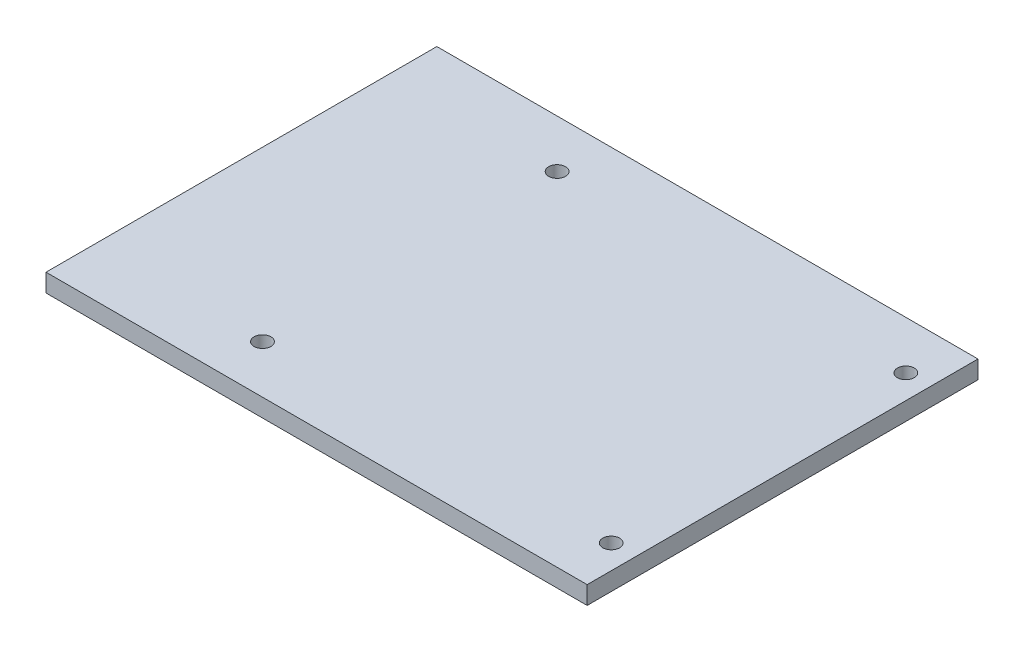
ISO-10303-21;
HEADER;
FILE_DESCRIPTION(('STEP AP214'),'2;1');
FILE_NAME('part.step','',(''),(''),'','','');
FILE_SCHEMA(('AUTOMOTIVE_DESIGN { 1 0 10303 214 1 1 1 1 }'));
ENDSEC;
DATA;
#1=APPLICATION_CONTEXT('core data for automotive mechanical design processes');
#2=APPLICATION_PROTOCOL_DEFINITION('international standard','automotive_design',2000,#1);
#3=PRODUCT_CONTEXT('',#1,'mechanical');
#4=PRODUCT('Part','Part','',(#3));
#5=PRODUCT_RELATED_PRODUCT_CATEGORY('part','',(#4));
#6=PRODUCT_DEFINITION_FORMATION('','',#4);
#7=PRODUCT_DEFINITION_CONTEXT('part definition',#1,'design');
#8=PRODUCT_DEFINITION('design','',#6,#7);
#9=PRODUCT_DEFINITION_SHAPE('','',#8);
#10=(LENGTH_UNIT() NAMED_UNIT(*) SI_UNIT(.MILLI.,.METRE.));
#11=(NAMED_UNIT(*) PLANE_ANGLE_UNIT() SI_UNIT($,.RADIAN.));
#12=(NAMED_UNIT(*) SI_UNIT($,.STERADIAN.) SOLID_ANGLE_UNIT());
#13=UNCERTAINTY_MEASURE_WITH_UNIT(LENGTH_MEASURE(1.E-05),#10,'distance_accuracy_value','');
#14=(GEOMETRIC_REPRESENTATION_CONTEXT(3) GLOBAL_UNCERTAINTY_ASSIGNED_CONTEXT((#13)) GLOBAL_UNIT_ASSIGNED_CONTEXT((#10,
#11,#12)) REPRESENTATION_CONTEXT('',''));
#15=CARTESIAN_POINT('',(0.,0.,0.));
#16=DIRECTION('',(0.,0.,1.));
#17=DIRECTION('',(1.,0.,0.));
#18=AXIS2_PLACEMENT_3D('',#15,#16,#17);
#19=CARTESIAN_POINT('',(45.,3.,32.5));
#20=DIRECTION('',(-1.,0.,0.));
#21=DIRECTION('',(0.,0.,1.));
#22=AXIS2_PLACEMENT_3D('',#19,#20,#21);
#23=PLANE('',#22);
#24=DIRECTION('',(0.,0.,-1.));
#25=VECTOR('',#24,1.);
#26=CARTESIAN_POINT('',(45.,0.,32.5));
#27=LINE('',#26,#25);
#28=CARTESIAN_POINT('',(45.,0.,32.5));
#29=VERTEX_POINT('',#28);
#30=CARTESIAN_POINT('',(45.,0.,-32.5));
#31=VERTEX_POINT('',#30);
#32=EDGE_CURVE('E104',#29,#31,#27,.T.);
#33=ORIENTED_EDGE('',*,*,#32,.T.);
#34=DIRECTION('',(0.,-1.,0.));
#35=VECTOR('',#34,1.);
#36=CARTESIAN_POINT('',(45.,3.,-32.5));
#37=LINE('',#36,#35);
#38=CARTESIAN_POINT('',(45.,3.,-32.5));
#39=VERTEX_POINT('',#38);
#40=EDGE_CURVE('E11',#39,#31,#37,.T.);
#41=ORIENTED_EDGE('',*,*,#40,.F.);
#42=DIRECTION('',(0.,0.,-1.));
#43=VECTOR('',#42,1.);
#44=CARTESIAN_POINT('',(45.,3.,32.5));
#45=LINE('',#44,#43);
#46=CARTESIAN_POINT('',(45.,3.,32.5));
#47=VERTEX_POINT('',#46);
#48=EDGE_CURVE('E92',#47,#39,#45,.T.);
#49=ORIENTED_EDGE('',*,*,#48,.F.);
#50=DIRECTION('',(0.,-1.,0.));
#51=VECTOR('',#50,1.);
#52=CARTESIAN_POINT('',(45.,3.,32.5));
#53=LINE('',#52,#51);
#54=EDGE_CURVE('E100',#47,#29,#53,.T.);
#55=ORIENTED_EDGE('',*,*,#54,.T.);
#56=EDGE_LOOP('',(#33,#41,#49,#55));
#57=FACE_BOUND('',#56,.T.);
#58=ADVANCED_FACE('F41',(#57),#23,.F.);
#59=CARTESIAN_POINT('',(-45.,3.,-32.5));
#60=DIRECTION('',(0.,0.,1.));
#61=DIRECTION('',(1.,0.,0.));
#62=AXIS2_PLACEMENT_3D('',#59,#60,#61);
#63=PLANE('',#62);
#64=DIRECTION('',(-1.,0.,0.));
#65=VECTOR('',#64,1.);
#66=CARTESIAN_POINT('',(-45.,0.,-32.5));
#67=LINE('',#66,#65);
#68=CARTESIAN_POINT('',(-45.,0.,-32.5));
#69=VERTEX_POINT('',#68);
#70=EDGE_CURVE('E96',#31,#69,#67,.T.);
#71=ORIENTED_EDGE('',*,*,#70,.T.);
#72=DIRECTION('',(0.,-1.,0.));
#73=VECTOR('',#72,1.);
#74=CARTESIAN_POINT('',(-45.,3.,-32.5));
#75=LINE('',#74,#73);
#76=CARTESIAN_POINT('',(-45.,3.,-32.5));
#77=VERTEX_POINT('',#76);
#78=EDGE_CURVE('E49',#77,#69,#75,.T.);
#79=ORIENTED_EDGE('',*,*,#78,.F.);
#80=DIRECTION('',(-1.,0.,0.));
#81=VECTOR('',#80,1.);
#82=CARTESIAN_POINT('',(-45.,3.,-32.5));
#83=LINE('',#82,#81);
#84=EDGE_CURVE('E87',#39,#77,#83,.T.);
#85=ORIENTED_EDGE('',*,*,#84,.F.);
#86=ORIENTED_EDGE('',*,*,#40,.T.);
#87=EDGE_LOOP('',(#71,#79,#85,#86));
#88=FACE_BOUND('',#87,.T.);
#89=ADVANCED_FACE('F95',(#88),#63,.F.);
#90=CARTESIAN_POINT('',(-45.,3.,32.5));
#91=DIRECTION('',(1.,0.,0.));
#92=DIRECTION('',(0.,0.,-1.));
#93=AXIS2_PLACEMENT_3D('',#90,#91,#92);
#94=PLANE('',#93);
#95=DIRECTION('',(0.,0.,1.));
#96=VECTOR('',#95,1.);
#97=CARTESIAN_POINT('',(-45.,0.,32.5));
#98=LINE('',#97,#96);
#99=CARTESIAN_POINT('',(-45.,0.,32.5));
#100=VERTEX_POINT('',#99);
#101=EDGE_CURVE('E74',#69,#100,#98,.T.);
#102=ORIENTED_EDGE('',*,*,#101,.T.);
#103=DIRECTION('',(0.,-1.,0.));
#104=VECTOR('',#103,1.);
#105=CARTESIAN_POINT('',(-45.,3.,32.5));
#106=LINE('',#105,#104);
#107=CARTESIAN_POINT('',(-45.,3.,32.5));
#108=VERTEX_POINT('',#107);
#109=EDGE_CURVE('E97',#108,#100,#106,.T.);
#110=ORIENTED_EDGE('',*,*,#109,.F.);
#111=DIRECTION('',(0.,0.,1.));
#112=VECTOR('',#111,1.);
#113=CARTESIAN_POINT('',(-45.,3.,32.5));
#114=LINE('',#113,#112);
#115=EDGE_CURVE('E90',#77,#108,#114,.T.);
#116=ORIENTED_EDGE('',*,*,#115,.F.);
#117=ORIENTED_EDGE('',*,*,#78,.T.);
#118=EDGE_LOOP('',(#102,#110,#116,#117));
#119=FACE_BOUND('',#118,.T.);
#120=ADVANCED_FACE('F98',(#119),#94,.F.);
#121=CARTESIAN_POINT('',(-45.,3.,32.5));
#122=DIRECTION('',(0.,0.,-1.));
#123=DIRECTION('',(-1.,0.,0.));
#124=AXIS2_PLACEMENT_3D('',#121,#122,#123);
#125=PLANE('',#124);
#126=DIRECTION('',(1.,0.,0.));
#127=VECTOR('',#126,1.);
#128=CARTESIAN_POINT('',(-45.,0.,32.5));
#129=LINE('',#128,#127);
#130=EDGE_CURVE('E80',#100,#29,#129,.T.);
#131=ORIENTED_EDGE('',*,*,#130,.T.);
#132=ORIENTED_EDGE('',*,*,#54,.F.);
#133=DIRECTION('',(1.,0.,0.));
#134=VECTOR('',#133,1.);
#135=CARTESIAN_POINT('',(-45.,3.,32.5));
#136=LINE('',#135,#134);
#137=EDGE_CURVE('E57',#108,#47,#136,.T.);
#138=ORIENTED_EDGE('',*,*,#137,.F.);
#139=ORIENTED_EDGE('',*,*,#109,.T.);
#140=EDGE_LOOP('',(#131,#132,#138,#139));
#141=FACE_BOUND('',#140,.T.);
#142=ADVANCED_FACE('F112',(#141),#125,.F.);
#143=CARTESIAN_POINT('',(0.,3.,0.));
#144=DIRECTION('',(0.,-1.,0.));
#145=DIRECTION('',(0.,0.,-1.));
#146=AXIS2_PLACEMENT_3D('',#143,#144,#145);
#147=PLANE('',#146);
#148=CARTESIAN_POINT('',(41.,3.,-24.5));
#149=DIRECTION('',(0.,1.,0.));
#150=DIRECTION('',(0.,0.,1.));
#151=AXIS2_PLACEMENT_3D('',#148,#149,#150);
#152=CIRCLE('',#151,1.4);
#153=CARTESIAN_POINT('',(41.,3.,-23.1));
#154=VERTEX_POINT('',#153);
#155=EDGE_CURVE('E121',#154,#154,#152,.T.);
#156=ORIENTED_EDGE('',*,*,#155,.F.);
#157=EDGE_LOOP('',(#156));
#158=FACE_BOUND('',#157,.T.);
#159=CARTESIAN_POINT('',(-17.,3.,24.5));
#160=DIRECTION('',(0.,1.,0.));
#161=DIRECTION('',(0.,0.,1.));
#162=AXIS2_PLACEMENT_3D('',#159,#160,#161);
#163=CIRCLE('',#162,1.4);
#164=CARTESIAN_POINT('',(-17.,3.,25.9));
#165=VERTEX_POINT('',#164);
#166=EDGE_CURVE('E127',#165,#165,#163,.T.);
#167=ORIENTED_EDGE('',*,*,#166,.F.);
#168=EDGE_LOOP('',(#167));
#169=FACE_BOUND('',#168,.T.);
#170=CARTESIAN_POINT('',(41.,3.,24.5));
#171=DIRECTION('',(0.,1.,0.));
#172=DIRECTION('',(0.,0.,1.));
#173=AXIS2_PLACEMENT_3D('',#170,#171,#172);
#174=CIRCLE('',#173,1.4);
#175=CARTESIAN_POINT('',(41.,3.,25.9));
#176=VERTEX_POINT('',#175);
#177=EDGE_CURVE('E128',#176,#176,#174,.T.);
#178=ORIENTED_EDGE('',*,*,#177,.F.);
#179=EDGE_LOOP('',(#178));
#180=FACE_BOUND('',#179,.T.);
#181=CARTESIAN_POINT('',(-17.,3.,-24.5));
#182=DIRECTION('',(0.,1.,0.));
#183=DIRECTION('',(0.,0.,1.));
#184=AXIS2_PLACEMENT_3D('',#181,#182,#183);
#185=CIRCLE('',#184,1.4);
#186=CARTESIAN_POINT('',(-17.,3.,-23.1));
#187=VERTEX_POINT('',#186);
#188=EDGE_CURVE('E118',#187,#187,#185,.T.);
#189=ORIENTED_EDGE('',*,*,#188,.F.);
#190=EDGE_LOOP('',(#189));
#191=FACE_BOUND('',#190,.T.);
#192=ORIENTED_EDGE('',*,*,#48,.T.);
#193=ORIENTED_EDGE('',*,*,#84,.T.);
#194=ORIENTED_EDGE('',*,*,#115,.T.);
#195=ORIENTED_EDGE('',*,*,#137,.T.);
#196=EDGE_LOOP('',(#192,#193,#194,#195));
#197=FACE_BOUND('',#196,.T.);
#198=ADVANCED_FACE('F88',(#158,#169,#180,#191,#197),#147,.F.);
#199=CARTESIAN_POINT('',(0.,0.,0.));
#200=DIRECTION('',(0.,-1.,0.));
#201=DIRECTION('',(0.,0.,-1.));
#202=AXIS2_PLACEMENT_3D('',#199,#200,#201);
#203=PLANE('',#202);
#204=CARTESIAN_POINT('',(41.,0.,-24.5));
#205=DIRECTION('',(0.,1.,0.));
#206=DIRECTION('',(0.,0.,1.));
#207=AXIS2_PLACEMENT_3D('',#204,#205,#206);
#208=CIRCLE('',#207,1.4);
#209=CARTESIAN_POINT('',(41.,0.,-23.1));
#210=VERTEX_POINT('',#209);
#211=EDGE_CURVE('E131',#210,#210,#208,.T.);
#212=ORIENTED_EDGE('',*,*,#211,.T.);
#213=EDGE_LOOP('',(#212));
#214=FACE_BOUND('',#213,.T.);
#215=CARTESIAN_POINT('',(-17.,0.,24.5));
#216=DIRECTION('',(0.,1.,0.));
#217=DIRECTION('',(0.,0.,1.));
#218=AXIS2_PLACEMENT_3D('',#215,#216,#217);
#219=CIRCLE('',#218,1.4);
#220=CARTESIAN_POINT('',(-17.,0.,25.9));
#221=VERTEX_POINT('',#220);
#222=EDGE_CURVE('E124',#221,#221,#219,.T.);
#223=ORIENTED_EDGE('',*,*,#222,.T.);
#224=EDGE_LOOP('',(#223));
#225=FACE_BOUND('',#224,.T.);
#226=CARTESIAN_POINT('',(41.,0.,24.5));
#227=DIRECTION('',(0.,1.,0.));
#228=DIRECTION('',(0.,0.,1.));
#229=AXIS2_PLACEMENT_3D('',#226,#227,#228);
#230=CIRCLE('',#229,1.4);
#231=CARTESIAN_POINT('',(41.,0.,25.9));
#232=VERTEX_POINT('',#231);
#233=EDGE_CURVE('E136',#232,#232,#230,.T.);
#234=ORIENTED_EDGE('',*,*,#233,.T.);
#235=EDGE_LOOP('',(#234));
#236=FACE_BOUND('',#235,.T.);
#237=CARTESIAN_POINT('',(-17.,0.,-24.5));
#238=DIRECTION('',(0.,1.,0.));
#239=DIRECTION('',(0.,0.,1.));
#240=AXIS2_PLACEMENT_3D('',#237,#238,#239);
#241=CIRCLE('',#240,1.4);
#242=CARTESIAN_POINT('',(-17.,0.,-23.1));
#243=VERTEX_POINT('',#242);
#244=EDGE_CURVE('E107',#243,#243,#241,.T.);
#245=ORIENTED_EDGE('',*,*,#244,.T.);
#246=EDGE_LOOP('',(#245));
#247=FACE_BOUND('',#246,.T.);
#248=ORIENTED_EDGE('',*,*,#32,.F.);
#249=ORIENTED_EDGE('',*,*,#130,.F.);
#250=ORIENTED_EDGE('',*,*,#101,.F.);
#251=ORIENTED_EDGE('',*,*,#70,.F.);
#252=EDGE_LOOP('',(#248,#249,#250,#251));
#253=FACE_BOUND('',#252,.T.);
#254=ADVANCED_FACE('F115',(#214,#225,#236,#247,#253),#203,.T.);
#255=CARTESIAN_POINT('',(-17.,0.,-24.5));
#256=DIRECTION('',(0.,1.,0.));
#257=DIRECTION('',(0.,0.,1.));
#258=AXIS2_PLACEMENT_3D('',#255,#256,#257);
#259=CYLINDRICAL_SURFACE('',#258,1.4);
#260=ORIENTED_EDGE('',*,*,#244,.F.);
#261=EDGE_LOOP('',(#260));
#262=FACE_BOUND('',#261,.T.);
#263=ORIENTED_EDGE('',*,*,#188,.T.);
#264=EDGE_LOOP('',(#263));
#265=FACE_BOUND('',#264,.T.);
#266=ADVANCED_FACE('F150',(#262,#265),#259,.F.);
#267=CARTESIAN_POINT('',(41.,0.,24.5));
#268=DIRECTION('',(0.,1.,0.));
#269=DIRECTION('',(0.,0.,1.));
#270=AXIS2_PLACEMENT_3D('',#267,#268,#269);
#271=CYLINDRICAL_SURFACE('',#270,1.4);
#272=ORIENTED_EDGE('',*,*,#233,.F.);
#273=EDGE_LOOP('',(#272));
#274=FACE_BOUND('',#273,.T.);
#275=ORIENTED_EDGE('',*,*,#177,.T.);
#276=EDGE_LOOP('',(#275));
#277=FACE_BOUND('',#276,.T.);
#278=ADVANCED_FACE('F142',(#274,#277),#271,.F.);
#279=CARTESIAN_POINT('',(-17.,0.,24.5));
#280=DIRECTION('',(0.,1.,0.));
#281=DIRECTION('',(0.,0.,1.));
#282=AXIS2_PLACEMENT_3D('',#279,#280,#281);
#283=CYLINDRICAL_SURFACE('',#282,1.4);
#284=ORIENTED_EDGE('',*,*,#222,.F.);
#285=EDGE_LOOP('',(#284));
#286=FACE_BOUND('',#285,.T.);
#287=ORIENTED_EDGE('',*,*,#166,.T.);
#288=EDGE_LOOP('',(#287));
#289=FACE_BOUND('',#288,.T.);
#290=ADVANCED_FACE('F158',(#286,#289),#283,.F.);
#291=CARTESIAN_POINT('',(41.,0.,-24.5));
#292=DIRECTION('',(0.,1.,0.));
#293=DIRECTION('',(0.,0.,1.));
#294=AXIS2_PLACEMENT_3D('',#291,#292,#293);
#295=CYLINDRICAL_SURFACE('',#294,1.4);
#296=ORIENTED_EDGE('',*,*,#211,.F.);
#297=EDGE_LOOP('',(#296));
#298=FACE_BOUND('',#297,.T.);
#299=ORIENTED_EDGE('',*,*,#155,.T.);
#300=EDGE_LOOP('',(#299));
#301=FACE_BOUND('',#300,.T.);
#302=ADVANCED_FACE('F209',(#298,#301),#295,.F.);
#303=CLOSED_SHELL('',(#58,#89,#120,#142,#198,#254,#266,#278,#290,#302));
#304=MANIFOLD_SOLID_BREP('B2',#303);
#305=ADVANCED_BREP_SHAPE_REPRESENTATION('',(#18,#304),#14);
#306=SHAPE_DEFINITION_REPRESENTATION(#9,#305);
ENDSEC;
END-ISO-10303-21;
